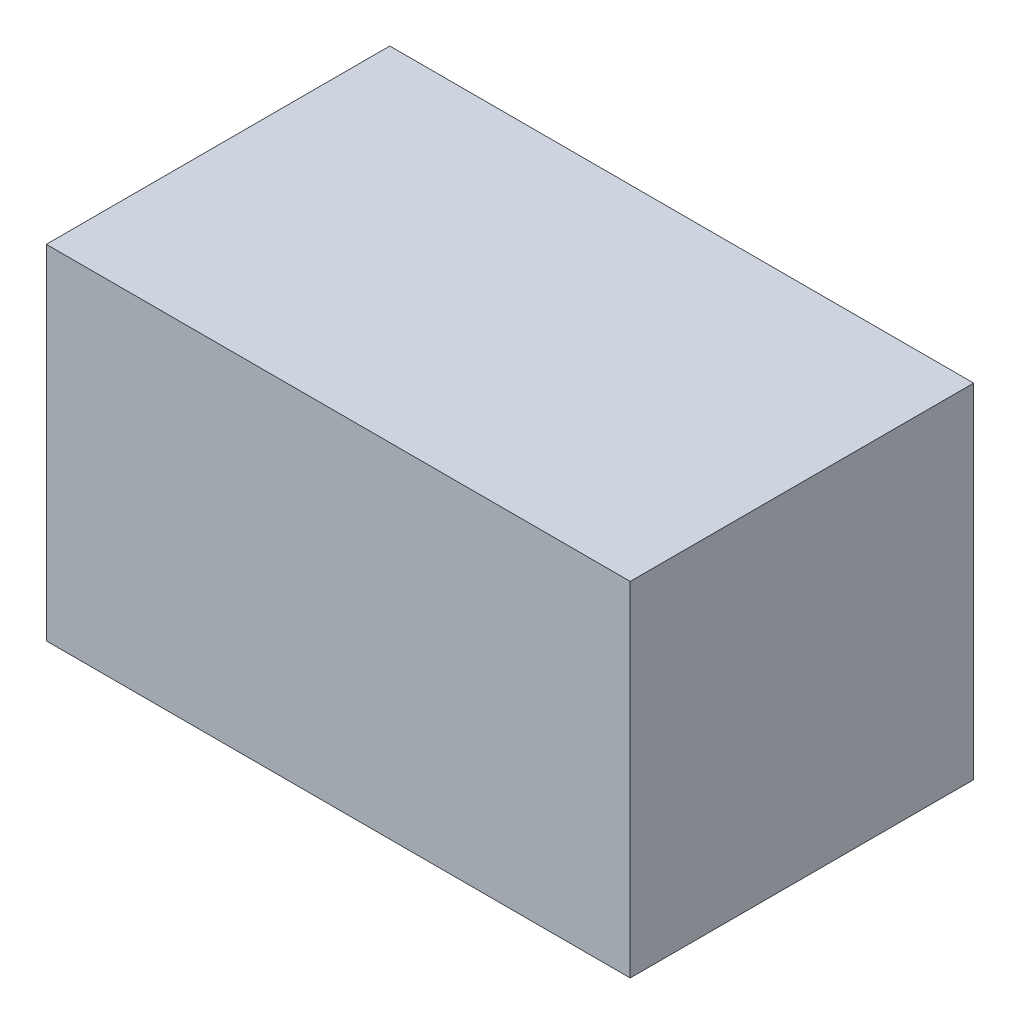
ISO-10303-21;
HEADER;
FILE_DESCRIPTION(('STEP AP214'),'2;1');
FILE_NAME('part.step','',(''),(''),'','','');
FILE_SCHEMA(('AUTOMOTIVE_DESIGN { 1 0 10303 214 1 1 1 1 }'));
ENDSEC;
DATA;
#1=APPLICATION_CONTEXT('core data for automotive mechanical design processes');
#2=APPLICATION_PROTOCOL_DEFINITION('international standard','automotive_design',2000,#1);
#3=PRODUCT_CONTEXT('',#1,'mechanical');
#4=PRODUCT('Part','Part','',(#3));
#5=PRODUCT_RELATED_PRODUCT_CATEGORY('part','',(#4));
#6=PRODUCT_DEFINITION_FORMATION('','',#4);
#7=PRODUCT_DEFINITION_CONTEXT('part definition',#1,'design');
#8=PRODUCT_DEFINITION('design','',#6,#7);
#9=PRODUCT_DEFINITION_SHAPE('','',#8);
#10=(LENGTH_UNIT() NAMED_UNIT(*) SI_UNIT(.MILLI.,.METRE.));
#11=(NAMED_UNIT(*) PLANE_ANGLE_UNIT() SI_UNIT($,.RADIAN.));
#12=(NAMED_UNIT(*) SI_UNIT($,.STERADIAN.) SOLID_ANGLE_UNIT());
#13=UNCERTAINTY_MEASURE_WITH_UNIT(LENGTH_MEASURE(1.E-05),#10,'distance_accuracy_value','');
#14=(GEOMETRIC_REPRESENTATION_CONTEXT(3) GLOBAL_UNCERTAINTY_ASSIGNED_CONTEXT((#13)) GLOBAL_UNIT_ASSIGNED_CONTEXT((#10,
#11,#12)) REPRESENTATION_CONTEXT('',''));
#15=CARTESIAN_POINT('',(0.,0.,0.));
#16=DIRECTION('',(0.,0.,1.));
#17=DIRECTION('',(1.,0.,0.));
#18=AXIS2_PLACEMENT_3D('',#15,#16,#17);
#19=CARTESIAN_POINT('',(0.,10.,0.));
#20=DIRECTION('',(1.,0.,0.));
#21=DIRECTION('',(0.,0.,-1.));
#22=AXIS2_PLACEMENT_3D('',#19,#20,#21);
#23=PLANE('',#22);
#24=DIRECTION('',(0.,0.,1.));
#25=VECTOR('',#24,1.);
#26=CARTESIAN_POINT('',(0.,0.,0.));
#27=LINE('',#26,#25);
#28=CARTESIAN_POINT('',(0.,0.,-10.));
#29=VERTEX_POINT('',#28);
#30=CARTESIAN_POINT('',(0.,0.,0.));
#31=VERTEX_POINT('',#30);
#32=EDGE_CURVE('E107',#29,#31,#27,.T.);
#33=ORIENTED_EDGE('',*,*,#32,.T.);
#34=DIRECTION('',(0.,-1.,0.));
#35=VECTOR('',#34,1.);
#36=CARTESIAN_POINT('',(0.,10.,0.));
#37=LINE('',#36,#35);
#38=CARTESIAN_POINT('',(0.,10.,0.));
#39=VERTEX_POINT('',#38);
#40=EDGE_CURVE('E11',#39,#31,#37,.T.);
#41=ORIENTED_EDGE('',*,*,#40,.F.);
#42=DIRECTION('',(0.,0.,1.));
#43=VECTOR('',#42,1.);
#44=CARTESIAN_POINT('',(0.,10.,0.));
#45=LINE('',#44,#43);
#46=CARTESIAN_POINT('',(0.,10.,-10.));
#47=VERTEX_POINT('',#46);
#48=EDGE_CURVE('E91',#47,#39,#45,.T.);
#49=ORIENTED_EDGE('',*,*,#48,.F.);
#50=DIRECTION('',(0.,-1.,0.));
#51=VECTOR('',#50,1.);
#52=CARTESIAN_POINT('',(0.,10.,-10.));
#53=LINE('',#52,#51);
#54=EDGE_CURVE('E103',#47,#29,#53,.T.);
#55=ORIENTED_EDGE('',*,*,#54,.T.);
#56=EDGE_LOOP('',(#33,#41,#49,#55));
#57=FACE_BOUND('',#56,.T.);
#58=ADVANCED_FACE('F39',(#57),#23,.F.);
#59=CARTESIAN_POINT('',(0.,10.,0.));
#60=DIRECTION('',(0.,0.,-1.));
#61=DIRECTION('',(-1.,0.,0.));
#62=AXIS2_PLACEMENT_3D('',#59,#60,#61);
#63=PLANE('',#62);
#64=DIRECTION('',(1.,0.,0.));
#65=VECTOR('',#64,1.);
#66=CARTESIAN_POINT('',(0.,0.,0.));
#67=LINE('',#66,#65);
#68=CARTESIAN_POINT('',(17.,0.,0.));
#69=VERTEX_POINT('',#68);
#70=EDGE_CURVE('E96',#31,#69,#67,.T.);
#71=ORIENTED_EDGE('',*,*,#70,.T.);
#72=DIRECTION('',(0.,-1.,0.));
#73=VECTOR('',#72,1.);
#74=CARTESIAN_POINT('',(17.,10.,0.));
#75=LINE('',#74,#73);
#76=CARTESIAN_POINT('',(17.,10.,0.));
#77=VERTEX_POINT('',#76);
#78=EDGE_CURVE('E48',#77,#69,#75,.T.);
#79=ORIENTED_EDGE('',*,*,#78,.F.);
#80=DIRECTION('',(1.,0.,0.));
#81=VECTOR('',#80,1.);
#82=CARTESIAN_POINT('',(0.,10.,0.));
#83=LINE('',#82,#81);
#84=EDGE_CURVE('E86',#39,#77,#83,.T.);
#85=ORIENTED_EDGE('',*,*,#84,.F.);
#86=ORIENTED_EDGE('',*,*,#40,.T.);
#87=EDGE_LOOP('',(#71,#79,#85,#86));
#88=FACE_BOUND('',#87,.T.);
#89=ADVANCED_FACE('F95',(#88),#63,.F.);
#90=CARTESIAN_POINT('',(17.,10.,0.));
#91=DIRECTION('',(-1.,0.,0.));
#92=DIRECTION('',(0.,0.,1.));
#93=AXIS2_PLACEMENT_3D('',#90,#91,#92);
#94=PLANE('',#93);
#95=DIRECTION('',(0.,0.,-1.));
#96=VECTOR('',#95,1.);
#97=CARTESIAN_POINT('',(17.,0.,0.));
#98=LINE('',#97,#96);
#99=CARTESIAN_POINT('',(17.,0.,-10.));
#100=VERTEX_POINT('',#99);
#101=EDGE_CURVE('E73',#69,#100,#98,.T.);
#102=ORIENTED_EDGE('',*,*,#101,.T.);
#103=DIRECTION('',(0.,-1.,0.));
#104=VECTOR('',#103,1.);
#105=CARTESIAN_POINT('',(17.,10.,-10.));
#106=LINE('',#105,#104);
#107=CARTESIAN_POINT('',(17.,10.,-10.));
#108=VERTEX_POINT('',#107);
#109=EDGE_CURVE('E98',#108,#100,#106,.T.);
#110=ORIENTED_EDGE('',*,*,#109,.F.);
#111=DIRECTION('',(0.,0.,-1.));
#112=VECTOR('',#111,1.);
#113=CARTESIAN_POINT('',(17.,10.,0.));
#114=LINE('',#113,#112);
#115=EDGE_CURVE('E89',#77,#108,#114,.T.);
#116=ORIENTED_EDGE('',*,*,#115,.F.);
#117=ORIENTED_EDGE('',*,*,#78,.T.);
#118=EDGE_LOOP('',(#102,#110,#116,#117));
#119=FACE_BOUND('',#118,.T.);
#120=ADVANCED_FACE('F99',(#119),#94,.F.);
#121=CARTESIAN_POINT('',(0.,10.,-10.));
#122=DIRECTION('',(0.,0.,1.));
#123=DIRECTION('',(1.,0.,0.));
#124=AXIS2_PLACEMENT_3D('',#121,#122,#123);
#125=PLANE('',#124);
#126=DIRECTION('',(-1.,0.,0.));
#127=VECTOR('',#126,1.);
#128=CARTESIAN_POINT('',(0.,0.,-10.));
#129=LINE('',#128,#127);
#130=EDGE_CURVE('E79',#100,#29,#129,.T.);
#131=ORIENTED_EDGE('',*,*,#130,.T.);
#132=ORIENTED_EDGE('',*,*,#54,.F.);
#133=DIRECTION('',(-1.,0.,0.));
#134=VECTOR('',#133,1.);
#135=CARTESIAN_POINT('',(0.,10.,-10.));
#136=LINE('',#135,#134);
#137=EDGE_CURVE('E56',#108,#47,#136,.T.);
#138=ORIENTED_EDGE('',*,*,#137,.F.);
#139=ORIENTED_EDGE('',*,*,#109,.T.);
#140=EDGE_LOOP('',(#131,#132,#138,#139));
#141=FACE_BOUND('',#140,.T.);
#142=ADVANCED_FACE('F120',(#141),#125,.F.);
#143=CARTESIAN_POINT('',(0.,10.,0.));
#144=DIRECTION('',(0.,-1.,0.));
#145=DIRECTION('',(0.,0.,-1.));
#146=AXIS2_PLACEMENT_3D('',#143,#144,#145);
#147=PLANE('',#146);
#148=ORIENTED_EDGE('',*,*,#48,.T.);
#149=ORIENTED_EDGE('',*,*,#84,.T.);
#150=ORIENTED_EDGE('',*,*,#115,.T.);
#151=ORIENTED_EDGE('',*,*,#137,.T.);
#152=EDGE_LOOP('',(#148,#149,#150,#151));
#153=FACE_BOUND('',#152,.T.);
#154=ADVANCED_FACE('F87',(#153),#147,.F.);
#155=CARTESIAN_POINT('',(0.,0.,0.));
#156=DIRECTION('',(0.,-1.,0.));
#157=DIRECTION('',(0.,0.,-1.));
#158=AXIS2_PLACEMENT_3D('',#155,#156,#157);
#159=PLANE('',#158);
#160=ORIENTED_EDGE('',*,*,#32,.F.);
#161=ORIENTED_EDGE('',*,*,#130,.F.);
#162=ORIENTED_EDGE('',*,*,#101,.F.);
#163=ORIENTED_EDGE('',*,*,#70,.F.);
#164=EDGE_LOOP('',(#160,#161,#162,#163));
#165=FACE_BOUND('',#164,.T.);
#166=ADVANCED_FACE('F123',(#165),#159,.T.);
#167=CLOSED_SHELL('',(#58,#89,#120,#142,#154,#166));
#168=MANIFOLD_SOLID_BREP('B2',#167);
#169=ADVANCED_BREP_SHAPE_REPRESENTATION('',(#18,#168),#14);
#170=SHAPE_DEFINITION_REPRESENTATION(#9,#169);
ENDSEC;
END-ISO-10303-21;
